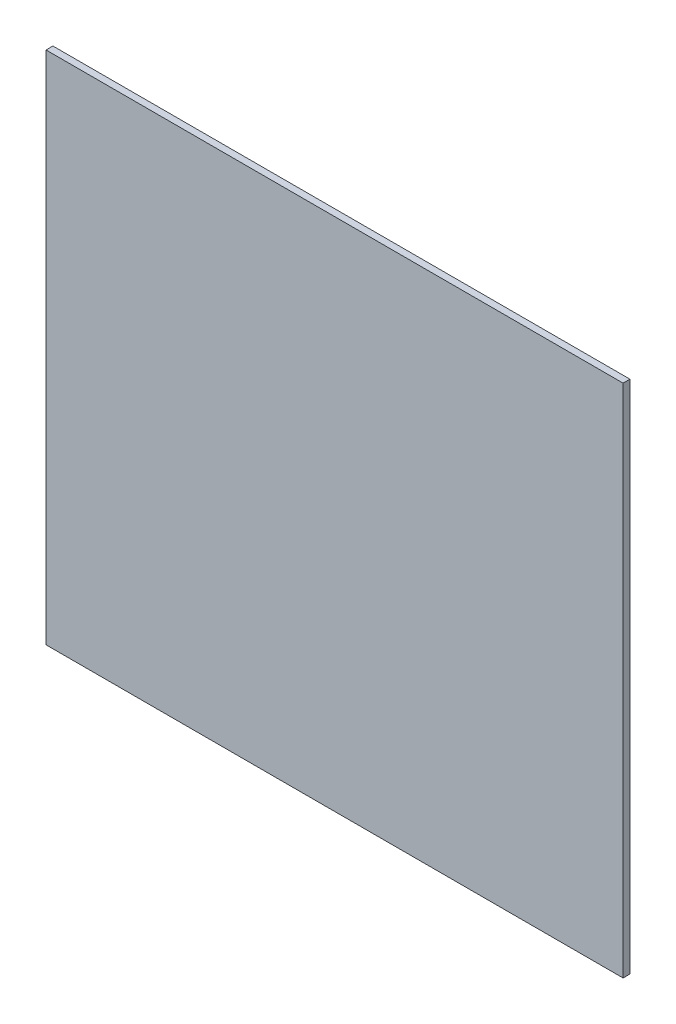
ISO-10303-21;
HEADER;
FILE_DESCRIPTION(('STEP AP214'),'2;1');
FILE_NAME('part.step','',(''),(''),'','','');
FILE_SCHEMA(('AUTOMOTIVE_DESIGN { 1 0 10303 214 1 1 1 1 }'));
ENDSEC;
DATA;
#1=APPLICATION_CONTEXT('core data for automotive mechanical design processes');
#2=APPLICATION_PROTOCOL_DEFINITION('international standard','automotive_design',2000,#1);
#3=PRODUCT_CONTEXT('',#1,'mechanical');
#4=PRODUCT('Part','Part','',(#3));
#5=PRODUCT_RELATED_PRODUCT_CATEGORY('part','',(#4));
#6=PRODUCT_DEFINITION_FORMATION('','',#4);
#7=PRODUCT_DEFINITION_CONTEXT('part definition',#1,'design');
#8=PRODUCT_DEFINITION('design','',#6,#7);
#9=PRODUCT_DEFINITION_SHAPE('','',#8);
#10=(LENGTH_UNIT() NAMED_UNIT(*) SI_UNIT(.MILLI.,.METRE.));
#11=(NAMED_UNIT(*) PLANE_ANGLE_UNIT() SI_UNIT($,.RADIAN.));
#12=(NAMED_UNIT(*) SI_UNIT($,.STERADIAN.) SOLID_ANGLE_UNIT());
#13=UNCERTAINTY_MEASURE_WITH_UNIT(LENGTH_MEASURE(1.E-05),#10,'distance_accuracy_value','');
#14=(GEOMETRIC_REPRESENTATION_CONTEXT(3) GLOBAL_UNCERTAINTY_ASSIGNED_CONTEXT((#13)) GLOBAL_UNIT_ASSIGNED_CONTEXT((#10,
#11,#12)) REPRESENTATION_CONTEXT('',''));
#15=CARTESIAN_POINT('',(0.,0.,0.));
#16=DIRECTION('',(0.,0.,1.));
#17=DIRECTION('',(1.,0.,0.));
#18=AXIS2_PLACEMENT_3D('',#15,#16,#17);
#19=CARTESIAN_POINT('',(210.,187.48,5.));
#20=DIRECTION('',(-1.,0.,0.));
#21=DIRECTION('',(0.,0.,1.));
#22=AXIS2_PLACEMENT_3D('',#19,#20,#21);
#23=PLANE('',#22);
#24=DIRECTION('',(0.,1.,0.));
#25=VECTOR('',#24,1.);
#26=CARTESIAN_POINT('',(210.,187.48,0.));
#27=LINE('',#26,#25);
#28=CARTESIAN_POINT('',(210.,-187.48,0.));
#29=VERTEX_POINT('',#28);
#30=CARTESIAN_POINT('',(210.,187.48,0.));
#31=VERTEX_POINT('',#30);
#32=EDGE_CURVE('E97',#29,#31,#27,.T.);
#33=ORIENTED_EDGE('',*,*,#32,.T.);
#34=DIRECTION('',(0.,0.,-1.));
#35=VECTOR('',#34,1.);
#36=CARTESIAN_POINT('',(210.,187.48,5.));
#37=LINE('',#36,#35);
#38=CARTESIAN_POINT('',(210.,187.48,5.));
#39=VERTEX_POINT('',#38);
#40=EDGE_CURVE('E11',#39,#31,#37,.T.);
#41=ORIENTED_EDGE('',*,*,#40,.F.);
#42=DIRECTION('',(0.,1.,0.));
#43=VECTOR('',#42,1.);
#44=CARTESIAN_POINT('',(210.,187.48,5.));
#45=LINE('',#44,#43);
#46=CARTESIAN_POINT('',(210.,-187.48,5.));
#47=VERTEX_POINT('',#46);
#48=EDGE_CURVE('E85',#47,#39,#45,.T.);
#49=ORIENTED_EDGE('',*,*,#48,.F.);
#50=DIRECTION('',(0.,0.,-1.));
#51=VECTOR('',#50,1.);
#52=CARTESIAN_POINT('',(210.,-187.48,5.));
#53=LINE('',#52,#51);
#54=EDGE_CURVE('E93',#47,#29,#53,.T.);
#55=ORIENTED_EDGE('',*,*,#54,.T.);
#56=EDGE_LOOP('',(#33,#41,#49,#55));
#57=FACE_BOUND('',#56,.T.);
#58=ADVANCED_FACE('F34',(#57),#23,.F.);
#59=CARTESIAN_POINT('',(-210.,187.48,5.));
#60=DIRECTION('',(0.,-1.,0.));
#61=DIRECTION('',(0.,0.,-1.));
#62=AXIS2_PLACEMENT_3D('',#59,#60,#61);
#63=PLANE('',#62);
#64=DIRECTION('',(-1.,0.,0.));
#65=VECTOR('',#64,1.);
#66=CARTESIAN_POINT('',(-210.,187.48,0.));
#67=LINE('',#66,#65);
#68=CARTESIAN_POINT('',(-210.,187.48,0.));
#69=VERTEX_POINT('',#68);
#70=EDGE_CURVE('E89',#31,#69,#67,.T.);
#71=ORIENTED_EDGE('',*,*,#70,.T.);
#72=DIRECTION('',(0.,0.,-1.));
#73=VECTOR('',#72,1.);
#74=CARTESIAN_POINT('',(-210.,187.48,5.));
#75=LINE('',#74,#73);
#76=CARTESIAN_POINT('',(-210.,187.48,5.));
#77=VERTEX_POINT('',#76);
#78=EDGE_CURVE('E42',#77,#69,#75,.T.);
#79=ORIENTED_EDGE('',*,*,#78,.F.);
#80=DIRECTION('',(-1.,0.,0.));
#81=VECTOR('',#80,1.);
#82=CARTESIAN_POINT('',(-210.,187.48,5.));
#83=LINE('',#82,#81);
#84=EDGE_CURVE('E80',#39,#77,#83,.T.);
#85=ORIENTED_EDGE('',*,*,#84,.F.);
#86=ORIENTED_EDGE('',*,*,#40,.T.);
#87=EDGE_LOOP('',(#71,#79,#85,#86));
#88=FACE_BOUND('',#87,.T.);
#89=ADVANCED_FACE('F88',(#88),#63,.F.);
#90=CARTESIAN_POINT('',(-210.,187.48,5.));
#91=DIRECTION('',(1.,0.,0.));
#92=DIRECTION('',(0.,1.,0.));
#93=AXIS2_PLACEMENT_3D('',#90,#91,#92);
#94=PLANE('',#93);
#95=DIRECTION('',(0.,-1.,0.));
#96=VECTOR('',#95,1.);
#97=CARTESIAN_POINT('',(-210.,187.48,0.));
#98=LINE('',#97,#96);
#99=CARTESIAN_POINT('',(-210.,-187.48,0.));
#100=VERTEX_POINT('',#99);
#101=EDGE_CURVE('E67',#69,#100,#98,.T.);
#102=ORIENTED_EDGE('',*,*,#101,.T.);
#103=DIRECTION('',(0.,0.,-1.));
#104=VECTOR('',#103,1.);
#105=CARTESIAN_POINT('',(-210.,-187.48,5.));
#106=LINE('',#105,#104);
#107=CARTESIAN_POINT('',(-210.,-187.48,5.));
#108=VERTEX_POINT('',#107);
#109=EDGE_CURVE('E90',#108,#100,#106,.T.);
#110=ORIENTED_EDGE('',*,*,#109,.F.);
#111=DIRECTION('',(0.,-1.,0.));
#112=VECTOR('',#111,1.);
#113=CARTESIAN_POINT('',(-210.,187.48,5.));
#114=LINE('',#113,#112);
#115=EDGE_CURVE('E83',#77,#108,#114,.T.);
#116=ORIENTED_EDGE('',*,*,#115,.F.);
#117=ORIENTED_EDGE('',*,*,#78,.T.);
#118=EDGE_LOOP('',(#102,#110,#116,#117));
#119=FACE_BOUND('',#118,.T.);
#120=ADVANCED_FACE('F91',(#119),#94,.F.);
#121=CARTESIAN_POINT('',(-210.,-187.48,5.));
#122=DIRECTION('',(0.,1.,0.));
#123=DIRECTION('',(0.,0.,1.));
#124=AXIS2_PLACEMENT_3D('',#121,#122,#123);
#125=PLANE('',#124);
#126=DIRECTION('',(1.,0.,0.));
#127=VECTOR('',#126,1.);
#128=CARTESIAN_POINT('',(-210.,-187.48,0.));
#129=LINE('',#128,#127);
#130=EDGE_CURVE('E73',#100,#29,#129,.T.);
#131=ORIENTED_EDGE('',*,*,#130,.T.);
#132=ORIENTED_EDGE('',*,*,#54,.F.);
#133=DIRECTION('',(1.,0.,0.));
#134=VECTOR('',#133,1.);
#135=CARTESIAN_POINT('',(-210.,-187.48,5.));
#136=LINE('',#135,#134);
#137=EDGE_CURVE('E50',#108,#47,#136,.T.);
#138=ORIENTED_EDGE('',*,*,#137,.F.);
#139=ORIENTED_EDGE('',*,*,#109,.T.);
#140=EDGE_LOOP('',(#131,#132,#138,#139));
#141=FACE_BOUND('',#140,.T.);
#142=ADVANCED_FACE('F104',(#141),#125,.F.);
#143=CARTESIAN_POINT('',(0.,0.,5.));
#144=DIRECTION('',(0.,0.,1.));
#145=DIRECTION('',(1.,0.,0.));
#146=AXIS2_PLACEMENT_3D('',#143,#144,#145);
#147=PLANE('',#146);
#148=ORIENTED_EDGE('',*,*,#48,.T.);
#149=ORIENTED_EDGE('',*,*,#84,.T.);
#150=ORIENTED_EDGE('',*,*,#115,.T.);
#151=ORIENTED_EDGE('',*,*,#137,.T.);
#152=EDGE_LOOP('',(#148,#149,#150,#151));
#153=FACE_BOUND('',#152,.T.);
#154=ADVANCED_FACE('F81',(#153),#147,.T.);
#155=CARTESIAN_POINT('',(0.,0.,0.));
#156=DIRECTION('',(0.,0.,1.));
#157=DIRECTION('',(1.,0.,0.));
#158=AXIS2_PLACEMENT_3D('',#155,#156,#157);
#159=PLANE('',#158);
#160=ORIENTED_EDGE('',*,*,#32,.F.);
#161=ORIENTED_EDGE('',*,*,#130,.F.);
#162=ORIENTED_EDGE('',*,*,#101,.F.);
#163=ORIENTED_EDGE('',*,*,#70,.F.);
#164=EDGE_LOOP('',(#160,#161,#162,#163));
#165=FACE_BOUND('',#164,.T.);
#166=ADVANCED_FACE('F107',(#165),#159,.F.);
#167=CLOSED_SHELL('',(#58,#89,#120,#142,#154,#166));
#168=MANIFOLD_SOLID_BREP('B2',#167);
#169=ADVANCED_BREP_SHAPE_REPRESENTATION('',(#18,#168),#14);
#170=SHAPE_DEFINITION_REPRESENTATION(#9,#169);
ENDSEC;
END-ISO-10303-21;
